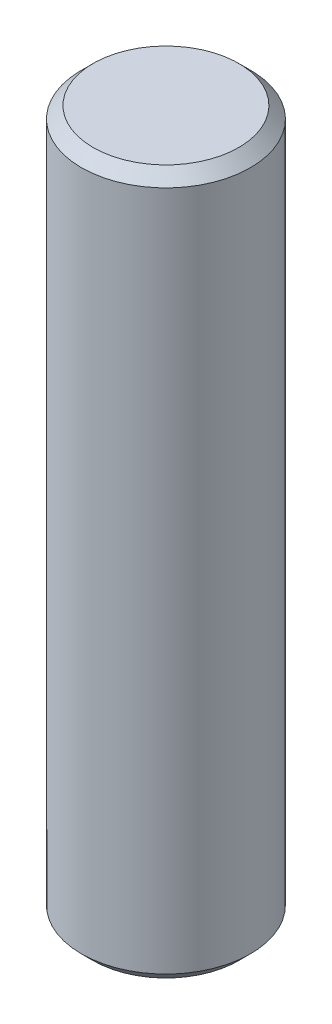
ISO-10303-21;
HEADER;
FILE_DESCRIPTION(('STEP AP214'),'2;1');
FILE_NAME('part.step','',(''),(''),'','','');
FILE_SCHEMA(('AUTOMOTIVE_DESIGN { 1 0 10303 214 1 1 1 1 }'));
ENDSEC;
DATA;
#1=APPLICATION_CONTEXT('core data for automotive mechanical design processes');
#2=APPLICATION_PROTOCOL_DEFINITION('international standard','automotive_design',2000,#1);
#3=PRODUCT_CONTEXT('',#1,'mechanical');
#4=PRODUCT('Part','Part','',(#3));
#5=PRODUCT_RELATED_PRODUCT_CATEGORY('part','',(#4));
#6=PRODUCT_DEFINITION_FORMATION('','',#4);
#7=PRODUCT_DEFINITION_CONTEXT('part definition',#1,'design');
#8=PRODUCT_DEFINITION('design','',#6,#7);
#9=PRODUCT_DEFINITION_SHAPE('','',#8);
#10=(LENGTH_UNIT() NAMED_UNIT(*) SI_UNIT(.MILLI.,.METRE.));
#11=(NAMED_UNIT(*) PLANE_ANGLE_UNIT() SI_UNIT($,.RADIAN.));
#12=(NAMED_UNIT(*) SI_UNIT($,.STERADIAN.) SOLID_ANGLE_UNIT());
#13=UNCERTAINTY_MEASURE_WITH_UNIT(LENGTH_MEASURE(1.E-05),#10,'distance_accuracy_value','');
#14=(GEOMETRIC_REPRESENTATION_CONTEXT(3) GLOBAL_UNCERTAINTY_ASSIGNED_CONTEXT((#13)) GLOBAL_UNIT_ASSIGNED_CONTEXT((#10,
#11,#12)) REPRESENTATION_CONTEXT('',''));
#15=CARTESIAN_POINT('',(0.,0.,0.));
#16=DIRECTION('',(0.,0.,1.));
#17=DIRECTION('',(1.,0.,0.));
#18=AXIS2_PLACEMENT_3D('',#15,#16,#17);
#19=CARTESIAN_POINT('',(0.,50.,0.));
#20=DIRECTION('',(0.,-1.,0.));
#21=DIRECTION('',(0.,0.,-1.));
#22=AXIS2_PLACEMENT_3D('',#19,#20,#21);
#23=CYLINDRICAL_SURFACE('',#22,6.);
#24=CARTESIAN_POINT('',(0.,0.827999999999995,0.));
#25=DIRECTION('',(0.,1.,0.));
#26=DIRECTION('',(0.,0.,1.));
#27=AXIS2_PLACEMENT_3D('',#24,#25,#26);
#28=CIRCLE('',#27,6.);
#29=CARTESIAN_POINT('',(0.,0.827999999999995,6.00000000000001));
#30=VERTEX_POINT('',#29);
#31=EDGE_CURVE('E59',#30,#30,#28,.T.);
#32=ORIENTED_EDGE('',*,*,#31,.T.);
#33=EDGE_LOOP('',(#32));
#34=FACE_BOUND('',#33,.T.);
#35=CARTESIAN_POINT('',(0.,49.172,0.));
#36=DIRECTION('',(0.,1.,0.));
#37=DIRECTION('',(0.,0.,1.));
#38=AXIS2_PLACEMENT_3D('',#35,#36,#37);
#39=CIRCLE('',#38,6.);
#40=CARTESIAN_POINT('',(0.,49.172,6.00000000000001));
#41=VERTEX_POINT('',#40);
#42=EDGE_CURVE('E63',#41,#41,#39,.F.);
#43=ORIENTED_EDGE('',*,*,#42,.T.);
#44=EDGE_LOOP('',(#43));
#45=FACE_BOUND('',#44,.T.);
#46=ADVANCED_FACE('F48',(#34,#45),#23,.T.);
#47=CARTESIAN_POINT('',(0.,50.,0.));
#48=DIRECTION('',(0.,1.,0.));
#49=DIRECTION('',(0.,0.,1.));
#50=AXIS2_PLACEMENT_3D('',#47,#48,#49);
#51=PLANE('',#50);
#52=CARTESIAN_POINT('',(0.,50.,0.));
#53=DIRECTION('',(0.,1.,0.));
#54=DIRECTION('',(0.,0.,1.));
#55=AXIS2_PLACEMENT_3D('',#52,#53,#54);
#56=CIRCLE('',#55,5.17199999999999);
#57=CARTESIAN_POINT('',(0.,50.,5.17199999999999));
#58=VERTEX_POINT('',#57);
#59=EDGE_CURVE('E12',#58,#58,#56,.T.);
#60=ORIENTED_EDGE('',*,*,#59,.T.);
#61=EDGE_LOOP('',(#60));
#62=FACE_BOUND('',#61,.T.);
#63=ADVANCED_FACE('F79',(#62),#51,.T.);
#64=CARTESIAN_POINT('',(0.,0.,0.));
#65=DIRECTION('',(0.,1.,0.));
#66=DIRECTION('',(0.,0.,1.));
#67=AXIS2_PLACEMENT_3D('',#64,#65,#66);
#68=PLANE('',#67);
#69=CARTESIAN_POINT('',(0.,0.,0.));
#70=DIRECTION('',(0.,1.,0.));
#71=DIRECTION('',(0.,0.,1.));
#72=AXIS2_PLACEMENT_3D('',#69,#70,#71);
#73=CIRCLE('',#72,5.172);
#74=CARTESIAN_POINT('',(0.,0.,5.172));
#75=VERTEX_POINT('',#74);
#76=EDGE_CURVE('E55',#75,#75,#73,.F.);
#77=ORIENTED_EDGE('',*,*,#76,.T.);
#78=EDGE_LOOP('',(#77));
#79=FACE_BOUND('',#78,.T.);
#80=ADVANCED_FACE('F76',(#79),#68,.F.);
#81=CARTESIAN_POINT('',(0.,0.827999999999995,0.));
#82=DIRECTION('',(0.,1.,0.));
#83=DIRECTION('',(0.,0.,1.));
#84=AXIS2_PLACEMENT_3D('',#81,#82,#83);
#85=CONICAL_SURFACE('',#84,6.,0.785398163397449);
#86=ORIENTED_EDGE('',*,*,#76,.F.);
#87=EDGE_LOOP('',(#86));
#88=FACE_BOUND('',#87,.T.);
#89=ORIENTED_EDGE('',*,*,#31,.F.);
#90=EDGE_LOOP('',(#89));
#91=FACE_BOUND('',#90,.T.);
#92=ADVANCED_FACE('F72',(#88,#91),#85,.T.);
#93=CARTESIAN_POINT('',(0.,50.,0.));
#94=DIRECTION('',(0.,-1.,0.));
#95=DIRECTION('',(0.,0.,-1.));
#96=AXIS2_PLACEMENT_3D('',#93,#94,#95);
#97=CONICAL_SURFACE('',#96,5.17199999999999,0.785398163397445);
#98=ORIENTED_EDGE('',*,*,#42,.F.);
#99=EDGE_LOOP('',(#98));
#100=FACE_BOUND('',#99,.T.);
#101=ORIENTED_EDGE('',*,*,#59,.F.);
#102=EDGE_LOOP('',(#101));
#103=FACE_BOUND('',#102,.T.);
#104=ADVANCED_FACE('F50',(#100,#103),#97,.T.);
#105=CLOSED_SHELL('',(#46,#63,#80,#92,#104));
#106=MANIFOLD_SOLID_BREP('B2',#105);
#107=ADVANCED_BREP_SHAPE_REPRESENTATION('',(#18,#106),#14);
#108=SHAPE_DEFINITION_REPRESENTATION(#9,#107);
ENDSEC;
END-ISO-10303-21;
